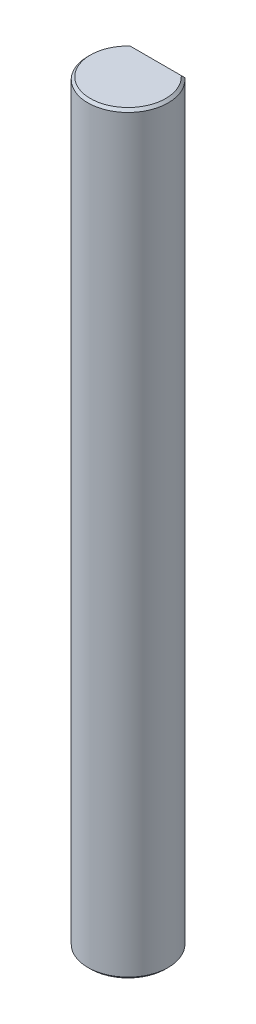
ISO-10303-21;
HEADER;
FILE_DESCRIPTION(('STEP AP214'),'2;1');
FILE_NAME('part.step','',(''),(''),'','','');
FILE_SCHEMA(('AUTOMOTIVE_DESIGN { 1 0 10303 214 1 1 1 1 }'));
ENDSEC;
DATA;
#1=APPLICATION_CONTEXT('core data for automotive mechanical design processes');
#2=APPLICATION_PROTOCOL_DEFINITION('international standard','automotive_design',2000,#1);
#3=PRODUCT_CONTEXT('',#1,'mechanical');
#4=PRODUCT('Part','Part','',(#3));
#5=PRODUCT_RELATED_PRODUCT_CATEGORY('part','',(#4));
#6=PRODUCT_DEFINITION_FORMATION('','',#4);
#7=PRODUCT_DEFINITION_CONTEXT('part definition',#1,'design');
#8=PRODUCT_DEFINITION('design','',#6,#7);
#9=PRODUCT_DEFINITION_SHAPE('','',#8);
#10=(LENGTH_UNIT() NAMED_UNIT(*) SI_UNIT(.MILLI.,.METRE.));
#11=(NAMED_UNIT(*) PLANE_ANGLE_UNIT() SI_UNIT($,.RADIAN.));
#12=(NAMED_UNIT(*) SI_UNIT($,.STERADIAN.) SOLID_ANGLE_UNIT());
#13=UNCERTAINTY_MEASURE_WITH_UNIT(LENGTH_MEASURE(1.E-05),#10,'distance_accuracy_value','');
#14=(GEOMETRIC_REPRESENTATION_CONTEXT(3) GLOBAL_UNCERTAINTY_ASSIGNED_CONTEXT((#13)) GLOBAL_UNIT_ASSIGNED_CONTEXT((#10,
#11,#12)) REPRESENTATION_CONTEXT('',''));
#15=CARTESIAN_POINT('',(0.,0.,0.));
#16=DIRECTION('',(0.,0.,1.));
#17=DIRECTION('',(1.,0.,0.));
#18=AXIS2_PLACEMENT_3D('',#15,#16,#17);
#19=CARTESIAN_POINT('',(0.,75.,0.));
#20=DIRECTION('',(0.,-1.,0.));
#21=DIRECTION('',(0.,0.,-1.));
#22=AXIS2_PLACEMENT_3D('',#19,#20,#21);
#23=CYLINDRICAL_SURFACE('',#22,4.);
#24=DIRECTION('',(0.,-1.,0.));
#25=VECTOR('',#24,1.);
#26=CARTESIAN_POINT('',(-2.64575131106459,75.,-3.));
#27=LINE('',#26,#25);
#28=CARTESIAN_POINT('',(-2.64575131106459,74.75,-3.));
#29=VERTEX_POINT('',#28);
#30=CARTESIAN_POINT('',(-2.64575131106459,0.25,-3.));
#31=VERTEX_POINT('',#30);
#32=EDGE_CURVE('E107',#29,#31,#27,.T.);
#33=ORIENTED_EDGE('',*,*,#32,.T.);
#34=CARTESIAN_POINT('',(0.,0.25,0.));
#35=DIRECTION('',(0.,1.,0.));
#36=DIRECTION('',(0.,0.,1.));
#37=AXIS2_PLACEMENT_3D('',#34,#35,#36);
#38=CIRCLE('',#37,4.);
#39=CARTESIAN_POINT('',(2.64575131106459,0.25,-3.));
#40=VERTEX_POINT('',#39);
#41=EDGE_CURVE('E123',#31,#40,#38,.T.);
#42=ORIENTED_EDGE('',*,*,#41,.T.);
#43=DIRECTION('',(0.,-1.,0.));
#44=VECTOR('',#43,1.);
#45=CARTESIAN_POINT('',(2.64575131106459,75.,-3.));
#46=LINE('',#45,#44);
#47=CARTESIAN_POINT('',(2.64575131106459,74.75,-3.));
#48=VERTEX_POINT('',#47);
#49=EDGE_CURVE('E166',#40,#48,#46,.F.);
#50=ORIENTED_EDGE('',*,*,#49,.T.);
#51=CARTESIAN_POINT('',(0.,74.75,0.));
#52=DIRECTION('',(0.,1.,0.));
#53=DIRECTION('',(0.,0.,1.));
#54=AXIS2_PLACEMENT_3D('',#51,#52,#53);
#55=CIRCLE('',#54,4.);
#56=EDGE_CURVE('E120',#48,#29,#55,.F.);
#57=ORIENTED_EDGE('',*,*,#56,.T.);
#58=EDGE_LOOP('',(#33,#42,#50,#57));
#59=FACE_BOUND('',#58,.T.);
#60=ADVANCED_FACE('F41',(#59),#23,.T.);
#61=CARTESIAN_POINT('',(0.,75.,0.));
#62=DIRECTION('',(0.,1.,0.));
#63=DIRECTION('',(0.,0.,1.));
#64=AXIS2_PLACEMENT_3D('',#61,#62,#63);
#65=PLANE('',#64);
#66=CARTESIAN_POINT('',(0.,75.,0.));
#67=DIRECTION('',(0.,1.,0.));
#68=DIRECTION('',(0.,0.,1.));
#69=AXIS2_PLACEMENT_3D('',#66,#67,#68);
#70=CIRCLE('',#69,3.75000000000001);
#71=CARTESIAN_POINT('',(-2.5495097567964,75.,-2.75));
#72=VERTEX_POINT('',#71);
#73=CARTESIAN_POINT('',(2.5495097567964,75.,-2.75));
#74=VERTEX_POINT('',#73);
#75=EDGE_CURVE('E57',#72,#74,#70,.T.);
#76=ORIENTED_EDGE('',*,*,#75,.T.);
#77=DIRECTION('',(-1.,0.,0.));
#78=VECTOR('',#77,1.);
#79=CARTESIAN_POINT('',(-2.64575131106459,75.,-2.75000000000001));
#80=LINE('',#79,#78);
#81=EDGE_CURVE('E11',#74,#72,#80,.T.);
#82=ORIENTED_EDGE('',*,*,#81,.T.);
#83=EDGE_LOOP('',(#76,#82));
#84=FACE_BOUND('',#83,.T.);
#85=ADVANCED_FACE('F180',(#84),#65,.T.);
#86=CARTESIAN_POINT('',(0.,0.,0.));
#87=DIRECTION('',(0.,1.,0.));
#88=DIRECTION('',(0.,0.,1.));
#89=AXIS2_PLACEMENT_3D('',#86,#87,#88);
#90=PLANE('',#89);
#91=CARTESIAN_POINT('',(0.,0.,0.));
#92=DIRECTION('',(0.,1.,0.));
#93=DIRECTION('',(0.,0.,1.));
#94=AXIS2_PLACEMENT_3D('',#91,#92,#93);
#95=CIRCLE('',#94,3.75);
#96=CARTESIAN_POINT('',(2.5495097567964,0.,-2.74999999999999));
#97=VERTEX_POINT('',#96);
#98=CARTESIAN_POINT('',(-2.5495097567964,0.,-2.74999999999999));
#99=VERTEX_POINT('',#98);
#100=EDGE_CURVE('E103',#97,#99,#95,.F.);
#101=ORIENTED_EDGE('',*,*,#100,.T.);
#102=DIRECTION('',(1.,0.,0.));
#103=VECTOR('',#102,1.);
#104=CARTESIAN_POINT('',(0.,0.,-2.75));
#105=LINE('',#104,#103);
#106=EDGE_CURVE('E94',#99,#97,#105,.T.);
#107=ORIENTED_EDGE('',*,*,#106,.T.);
#108=EDGE_LOOP('',(#101,#107));
#109=FACE_BOUND('',#108,.T.);
#110=ADVANCED_FACE('F109',(#109),#90,.F.);
#111=CARTESIAN_POINT('',(-4.,0.,-3.));
#112=DIRECTION('',(0.,0.,1.));
#113=DIRECTION('',(1.,0.,0.));
#114=AXIS2_PLACEMENT_3D('',#111,#112,#113);
#115=PLANE('',#114);
#116=ORIENTED_EDGE('',*,*,#49,.F.);
#117=DIRECTION('',(-1.,0.,0.));
#118=VECTOR('',#117,1.);
#119=CARTESIAN_POINT('',(-4.,0.250000000000004,-3.));
#120=LINE('',#119,#118);
#121=EDGE_CURVE('E96',#40,#31,#120,.T.);
#122=ORIENTED_EDGE('',*,*,#121,.T.);
#123=ORIENTED_EDGE('',*,*,#32,.F.);
#124=DIRECTION('',(1.,0.,0.));
#125=VECTOR('',#124,1.);
#126=CARTESIAN_POINT('',(2.64575131106459,74.75,-3.));
#127=LINE('',#126,#125);
#128=EDGE_CURVE('E111',#29,#48,#127,.T.);
#129=ORIENTED_EDGE('',*,*,#128,.T.);
#130=EDGE_LOOP('',(#116,#122,#123,#129));
#131=FACE_BOUND('',#130,.T.);
#132=ADVANCED_FACE('F175',(#131),#115,.F.);
#133=CARTESIAN_POINT('',(0.,0.25,0.));
#134=DIRECTION('',(0.,1.,0.));
#135=DIRECTION('',(0.,0.,1.));
#136=AXIS2_PLACEMENT_3D('',#133,#134,#135);
#137=CONICAL_SURFACE('',#136,4.,0.785398163397455);
#138=CARTESIAN_POINT('',(2.5495097567964,0.,-2.75));
#139=CARTESIAN_POINT('',(2.56582664272052,0.041613428620293,-2.79161342862029));
#140=CARTESIAN_POINT('',(2.58200521660594,0.0832534799716967,-2.83325347997169));
#141=CARTESIAN_POINT('',(2.61408573459701,0.166586813323958,-2.91658681332395));
#142=CARTESIAN_POINT('',(2.62998767880099,0.208280095305887,-2.95828009530588));
#143=CARTESIAN_POINT('',(2.64575131106462,0.249999999999998,-2.99999999999999));
#144=B_SPLINE_CURVE_WITH_KNOTS('',3,(#138,#139,#140,#141,#142,#143),.UNSPECIFIED.,.F.,.F.,(4,2,
4),(0.,0.183209732423121,0.366419399714018),.UNSPECIFIED.);
#145=EDGE_CURVE('E90',#40,#97,#144,.F.);
#146=ORIENTED_EDGE('',*,*,#145,.F.);
#147=ORIENTED_EDGE('',*,*,#41,.F.);
#148=CARTESIAN_POINT('',(-2.64575131106459,0.250000000000002,-3.));
#149=CARTESIAN_POINT('',(-2.62998767880097,0.20828009530589,-2.95828009530589));
#150=CARTESIAN_POINT('',(-2.614085734597,0.166586813323959,-2.91658681332395));
#151=CARTESIAN_POINT('',(-2.58200521660595,0.0832534799716957,-2.83325347997169));
#152=CARTESIAN_POINT('',(-2.56582664272053,0.0416134286202914,-2.79161342862029));
#153=CARTESIAN_POINT('',(-2.54950975679641,0.,-2.74999999999999));
#154=B_SPLINE_CURVE_WITH_KNOTS('',3,(#148,#149,#150,#151,#152,#153),.UNSPECIFIED.,.F.,.F.,(4,2,
4),(0.,0.183209667290897,0.366419399714019),.UNSPECIFIED.);
#155=EDGE_CURVE('E100',#99,#31,#154,.F.);
#156=ORIENTED_EDGE('',*,*,#155,.F.);
#157=ORIENTED_EDGE('',*,*,#100,.F.);
#158=EDGE_LOOP('',(#146,#147,#156,#157));
#159=FACE_BOUND('',#158,.T.);
#160=ADVANCED_FACE('F104',(#159),#137,.T.);
#161=CARTESIAN_POINT('',(0.,0.,-2.75));
#162=DIRECTION('',(0.,0.707106781186547,0.707106781186547));
#163=DIRECTION('',(1.,0.,0.));
#164=AXIS2_PLACEMENT_3D('',#161,#162,#163);
#165=PLANE('',#164);
#166=ORIENTED_EDGE('',*,*,#155,.T.);
#167=ORIENTED_EDGE('',*,*,#121,.F.);
#168=ORIENTED_EDGE('',*,*,#145,.T.);
#169=ORIENTED_EDGE('',*,*,#106,.F.);
#170=EDGE_LOOP('',(#166,#167,#168,#169));
#171=FACE_BOUND('',#170,.T.);
#172=ADVANCED_FACE('F92',(#171),#165,.F.);
#173=CARTESIAN_POINT('',(0.,75.,0.));
#174=DIRECTION('',(0.,-1.,0.));
#175=DIRECTION('',(0.,0.,-1.));
#176=AXIS2_PLACEMENT_3D('',#173,#174,#175);
#177=CONICAL_SURFACE('',#176,3.75000000000001,0.785398163397455);
#178=CARTESIAN_POINT('',(2.64575131106459,74.75,-3.));
#179=CARTESIAN_POINT('',(2.62998767880097,74.7917199046941,-2.95828009530589));
#180=CARTESIAN_POINT('',(2.614085734597,74.8334131866761,-2.91658681332396));
#181=CARTESIAN_POINT('',(2.58200521660595,74.9167465200283,-2.8332534799717));
#182=CARTESIAN_POINT('',(2.56582664272053,74.9583865713797,-2.7916134286203));
#183=CARTESIAN_POINT('',(2.54950975679641,75.,-2.75));
#184=B_SPLINE_CURVE_WITH_KNOTS('',3,(#178,#179,#180,#181,#182,#183),.UNSPECIFIED.,.F.,.F.,(4,2,
4),(0.,0.183209667290886,0.366419399713999),.UNSPECIFIED.);
#185=EDGE_CURVE('E155',#74,#48,#184,.F.);
#186=ORIENTED_EDGE('',*,*,#185,.F.);
#187=ORIENTED_EDGE('',*,*,#75,.F.);
#188=CARTESIAN_POINT('',(-2.54950975679641,75.,-2.75000000000001));
#189=CARTESIAN_POINT('',(-2.56582664272052,74.9583865713797,-2.7916134286203));
#190=CARTESIAN_POINT('',(-2.58200521660595,74.9167465200283,-2.83325347997171));
#191=CARTESIAN_POINT('',(-2.61408573459701,74.8334131866761,-2.91658681332396));
#192=CARTESIAN_POINT('',(-2.62998767880098,74.7917199046941,-2.95828009530589));
#193=CARTESIAN_POINT('',(-2.64575131106461,74.75,-2.99999999999999));
#194=B_SPLINE_CURVE_WITH_KNOTS('',3,(#188,#189,#190,#191,#192,#193),.UNSPECIFIED.,.F.,.F.,(4,2,
4),(0.,0.183209732423111,0.366419399713999),.UNSPECIFIED.);
#195=EDGE_CURVE('E47',#29,#72,#194,.F.);
#196=ORIENTED_EDGE('',*,*,#195,.F.);
#197=ORIENTED_EDGE('',*,*,#56,.F.);
#198=EDGE_LOOP('',(#186,#187,#196,#197));
#199=FACE_BOUND('',#198,.T.);
#200=ADVANCED_FACE('F146',(#199),#177,.T.);
#201=CARTESIAN_POINT('',(-4.,74.75,-3.));
#202=DIRECTION('',(0.,0.707106781186552,-0.707106781186543));
#203=DIRECTION('',(-1.,0.,0.));
#204=AXIS2_PLACEMENT_3D('',#201,#202,#203);
#205=PLANE('',#204);
#206=ORIENTED_EDGE('',*,*,#195,.T.);
#207=ORIENTED_EDGE('',*,*,#81,.F.);
#208=ORIENTED_EDGE('',*,*,#185,.T.);
#209=ORIENTED_EDGE('',*,*,#128,.F.);
#210=EDGE_LOOP('',(#206,#207,#208,#209));
#211=FACE_BOUND('',#210,.T.);
#212=ADVANCED_FACE('F44',(#211),#205,.T.);
#213=CLOSED_SHELL('',(#60,#85,#110,#132,#160,#172,#200,#212));
#214=MANIFOLD_SOLID_BREP('B2',#213);
#215=ADVANCED_BREP_SHAPE_REPRESENTATION('',(#18,#214),#14);
#216=SHAPE_DEFINITION_REPRESENTATION(#9,#215);
ENDSEC;
END-ISO-10303-21;
